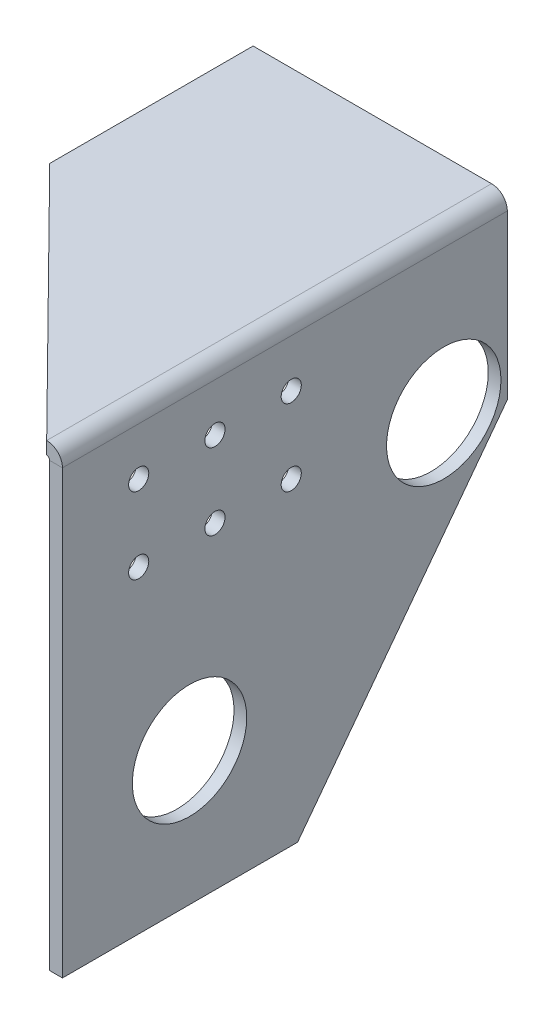
ISO-10303-21;
HEADER;
FILE_DESCRIPTION(('STEP AP214'),'2;1');
FILE_NAME('part.step','',(''),(''),'','','');
FILE_SCHEMA(('AUTOMOTIVE_DESIGN { 1 0 10303 214 1 1 1 1 }'));
ENDSEC;
DATA;
#1=APPLICATION_CONTEXT('core data for automotive mechanical design processes');
#2=APPLICATION_PROTOCOL_DEFINITION('international standard','automotive_design',2000,#1);
#3=PRODUCT_CONTEXT('',#1,'mechanical');
#4=PRODUCT('Part','Part','',(#3));
#5=PRODUCT_RELATED_PRODUCT_CATEGORY('part','',(#4));
#6=PRODUCT_DEFINITION_FORMATION('','',#4);
#7=PRODUCT_DEFINITION_CONTEXT('part definition',#1,'design');
#8=PRODUCT_DEFINITION('design','',#6,#7);
#9=PRODUCT_DEFINITION_SHAPE('','',#8);
#10=(LENGTH_UNIT() NAMED_UNIT(*) SI_UNIT(.MILLI.,.METRE.));
#11=(NAMED_UNIT(*) PLANE_ANGLE_UNIT() SI_UNIT($,.RADIAN.));
#12=(NAMED_UNIT(*) SI_UNIT($,.STERADIAN.) SOLID_ANGLE_UNIT());
#13=UNCERTAINTY_MEASURE_WITH_UNIT(LENGTH_MEASURE(1.E-05),#10,'distance_accuracy_value','');
#14=(GEOMETRIC_REPRESENTATION_CONTEXT(3) GLOBAL_UNCERTAINTY_ASSIGNED_CONTEXT((#13)) GLOBAL_UNIT_ASSIGNED_CONTEXT((#10,
#11,#12)) REPRESENTATION_CONTEXT('',''));
#15=CARTESIAN_POINT('',(0.,0.,0.));
#16=DIRECTION('',(0.,0.,1.));
#17=DIRECTION('',(1.,0.,0.));
#18=AXIS2_PLACEMENT_3D('',#15,#16,#17);
#19=CARTESIAN_POINT('',(0.,0.,111.125));
#20=DIRECTION('',(0.,1.,0.));
#21=DIRECTION('',(0.,0.,1.));
#22=AXIS2_PLACEMENT_3D('',#19,#20,#21);
#23=PLANE('',#22);
#24=DIRECTION('',(0.,0.,-1.));
#25=VECTOR('',#24,1.);
#26=CARTESIAN_POINT('',(0.,0.,111.125));
#27=LINE('',#26,#25);
#28=CARTESIAN_POINT('',(0.,0.,50.8));
#29=VERTEX_POINT('',#28);
#30=CARTESIAN_POINT('',(0.,0.,0.));
#31=VERTEX_POINT('',#30);
#32=EDGE_CURVE('E172',#29,#31,#27,.T.);
#33=ORIENTED_EDGE('',*,*,#32,.F.);
#34=DIRECTION('',(0.702598266829906,0.,0.711586730797879));
#35=VECTOR('',#34,1.);
#36=CARTESIAN_POINT('',(0.,0.,50.8));
#37=LINE('',#36,#35);
#38=CARTESIAN_POINT('',(59.563,0.,111.125));
#39=VERTEX_POINT('',#38);
#40=EDGE_CURVE('E189',#29,#39,#37,.T.);
#41=ORIENTED_EDGE('',*,*,#40,.T.);
#42=DIRECTION('',(0.,0.,-1.));
#43=VECTOR('',#42,1.);
#44=CARTESIAN_POINT('',(59.563,0.,111.125));
#45=LINE('',#44,#43);
#46=CARTESIAN_POINT('',(59.563,0.,0.));
#47=VERTEX_POINT('',#46);
#48=EDGE_CURVE('E133',#39,#47,#45,.T.);
#49=ORIENTED_EDGE('',*,*,#48,.T.);
#50=DIRECTION('',(1.,0.,0.));
#51=VECTOR('',#50,1.);
#52=CARTESIAN_POINT('',(0.,0.,0.));
#53=LINE('',#52,#51);
#54=EDGE_CURVE('E154',#31,#47,#53,.T.);
#55=ORIENTED_EDGE('',*,*,#54,.F.);
#56=EDGE_LOOP('',(#33,#41,#49,#55));
#57=FACE_BOUND('',#56,.T.);
#58=ADVANCED_FACE('F45',(#57),#23,.T.);
#59=CARTESIAN_POINT('',(0.,-3.175,111.125));
#60=DIRECTION('',(-1.,0.,0.));
#61=DIRECTION('',(0.,0.,1.));
#62=AXIS2_PLACEMENT_3D('',#59,#60,#61);
#63=PLANE('',#62);
#64=DIRECTION('',(0.,0.,-1.));
#65=VECTOR('',#64,1.);
#66=CARTESIAN_POINT('',(0.,-3.175,111.125));
#67=LINE('',#66,#65);
#68=CARTESIAN_POINT('',(0.,-3.175,50.8));
#69=VERTEX_POINT('',#68);
#70=CARTESIAN_POINT('',(0.,-3.175,0.));
#71=VERTEX_POINT('',#70);
#72=EDGE_CURVE('E170',#69,#71,#67,.T.);
#73=ORIENTED_EDGE('',*,*,#72,.F.);
#74=DIRECTION('',(0.,1.,0.));
#75=VECTOR('',#74,1.);
#76=CARTESIAN_POINT('',(0.,0.,50.8));
#77=LINE('',#76,#75);
#78=EDGE_CURVE('E199',#29,#69,#77,.F.);
#79=ORIENTED_EDGE('',*,*,#78,.F.);
#80=ORIENTED_EDGE('',*,*,#32,.T.);
#81=DIRECTION('',(0.,1.,0.));
#82=VECTOR('',#81,1.);
#83=CARTESIAN_POINT('',(0.,-3.175,0.));
#84=LINE('',#83,#82);
#85=EDGE_CURVE('E157',#71,#31,#84,.T.);
#86=ORIENTED_EDGE('',*,*,#85,.F.);
#87=EDGE_LOOP('',(#73,#79,#80,#86));
#88=FACE_BOUND('',#87,.T.);
#89=ADVANCED_FACE('F271',(#88),#63,.T.);
#90=CARTESIAN_POINT('',(0.,-3.175,111.125));
#91=DIRECTION('',(0.,1.,0.));
#92=DIRECTION('',(0.,0.,1.));
#93=AXIS2_PLACEMENT_3D('',#90,#91,#92);
#94=PLANE('',#93);
#95=DIRECTION('',(0.702598266829906,0.,0.711586730797879));
#96=VECTOR('',#95,1.);
#97=CARTESIAN_POINT('',(0.,-3.175,50.8));
#98=LINE('',#97,#96);
#99=CARTESIAN_POINT('',(59.563,-3.175,111.125));
#100=VERTEX_POINT('',#99);
#101=EDGE_CURVE('E192',#69,#100,#98,.T.);
#102=ORIENTED_EDGE('',*,*,#101,.F.);
#103=ORIENTED_EDGE('',*,*,#72,.T.);
#104=DIRECTION('',(1.,0.,0.));
#105=VECTOR('',#104,1.);
#106=CARTESIAN_POINT('',(0.,-3.175,0.));
#107=LINE('',#106,#105);
#108=CARTESIAN_POINT('',(59.563,-3.175,0.));
#109=VERTEX_POINT('',#108);
#110=EDGE_CURVE('E160',#71,#109,#107,.T.);
#111=ORIENTED_EDGE('',*,*,#110,.T.);
#112=DIRECTION('',(0.,0.,-1.));
#113=VECTOR('',#112,1.);
#114=CARTESIAN_POINT('',(59.563,-3.175,111.125));
#115=LINE('',#114,#113);
#116=EDGE_CURVE('E167',#100,#109,#115,.T.);
#117=ORIENTED_EDGE('',*,*,#116,.F.);
#118=EDGE_LOOP('',(#102,#103,#111,#117));
#119=FACE_BOUND('',#118,.T.);
#120=ADVANCED_FACE('F268',(#119),#94,.F.);
#121=CARTESIAN_POINT('',(63.5,-3.937,111.125));
#122=DIRECTION('',(0.,0.,1.));
#123=DIRECTION('',(1.,0.,0.));
#124=AXIS2_PLACEMENT_3D('',#121,#122,#123);
#125=PLANE('',#124);
#126=DIRECTION('',(-1.,0.,0.));
#127=VECTOR('',#126,1.);
#128=CARTESIAN_POINT('',(63.5,-3.937,111.125));
#129=LINE('',#128,#127);
#130=CARTESIAN_POINT('',(63.5,-3.937,111.125));
#131=VERTEX_POINT('',#130);
#132=CARTESIAN_POINT('',(60.325,-3.937,111.125));
#133=VERTEX_POINT('',#132);
#134=EDGE_CURVE('E53',#131,#133,#129,.T.);
#135=ORIENTED_EDGE('',*,*,#134,.F.);
#136=CARTESIAN_POINT('',(59.563,-3.937,111.125));
#137=DIRECTION('',(0.,0.,1.));
#138=DIRECTION('',(1.,0.,0.));
#139=AXIS2_PLACEMENT_3D('',#136,#137,#138);
#140=CIRCLE('',#139,3.937);
#141=EDGE_CURVE('E113',#39,#131,#140,.F.);
#142=ORIENTED_EDGE('',*,*,#141,.F.);
#143=DIRECTION('',(0.,1.,0.));
#144=VECTOR('',#143,1.);
#145=CARTESIAN_POINT('',(59.563,-3.175,111.125));
#146=LINE('',#145,#144);
#147=EDGE_CURVE('E117',#100,#39,#146,.T.);
#148=ORIENTED_EDGE('',*,*,#147,.F.);
#149=CARTESIAN_POINT('',(59.563,-3.937,111.125));
#150=DIRECTION('',(0.,0.,1.));
#151=DIRECTION('',(1.,0.,0.));
#152=AXIS2_PLACEMENT_3D('',#149,#150,#151);
#153=CIRCLE('',#152,0.762);
#154=EDGE_CURVE('E115',#100,#133,#153,.F.);
#155=ORIENTED_EDGE('',*,*,#154,.T.);
#156=EDGE_LOOP('',(#135,#142,#148,#155));
#157=FACE_BOUND('',#156,.T.);
#158=ADVANCED_FACE('F47',(#157),#125,.T.);
#159=CARTESIAN_POINT('',(59.563,-3.175,111.125));
#160=DIRECTION('',(0.,0.,1.));
#161=DIRECTION('',(1.,0.,0.));
#162=AXIS2_PLACEMENT_3D('',#159,#160,#161);
#163=PLANE('',#162);
#164=DIRECTION('',(0.,-1.,0.));
#165=VECTOR('',#164,1.);
#166=CARTESIAN_POINT('',(63.5,0.,111.125));
#167=LINE('',#166,#165);
#168=CARTESIAN_POINT('',(63.5,-114.3,111.125));
#169=VERTEX_POINT('',#168);
#170=EDGE_CURVE('E127',#131,#169,#167,.T.);
#171=ORIENTED_EDGE('',*,*,#170,.F.);
#172=ORIENTED_EDGE('',*,*,#134,.T.);
#173=DIRECTION('',(0.,-1.,0.));
#174=VECTOR('',#173,1.);
#175=CARTESIAN_POINT('',(60.325,0.,111.125));
#176=LINE('',#175,#174);
#177=CARTESIAN_POINT('',(60.325,-114.3,111.125));
#178=VERTEX_POINT('',#177);
#179=EDGE_CURVE('E101',#133,#178,#176,.T.);
#180=ORIENTED_EDGE('',*,*,#179,.T.);
#181=DIRECTION('',(-1.,0.,0.));
#182=VECTOR('',#181,1.);
#183=CARTESIAN_POINT('',(63.5,-114.3,111.125));
#184=LINE('',#183,#182);
#185=EDGE_CURVE('E137',#169,#178,#184,.T.);
#186=ORIENTED_EDGE('',*,*,#185,.F.);
#187=EDGE_LOOP('',(#171,#172,#180,#186));
#188=FACE_BOUND('',#187,.T.);
#189=ADVANCED_FACE('F135',(#188),#163,.T.);
#190=CARTESIAN_POINT('',(59.563,0.,0.));
#191=DIRECTION('',(0.,0.,-1.));
#192=DIRECTION('',(-1.,0.,0.));
#193=AXIS2_PLACEMENT_3D('',#190,#191,#192);
#194=PLANE('',#193);
#195=DIRECTION('',(0.,-1.,0.));
#196=VECTOR('',#195,1.);
#197=CARTESIAN_POINT('',(59.563,0.,0.));
#198=LINE('',#197,#196);
#199=EDGE_CURVE('E180',#47,#109,#198,.T.);
#200=ORIENTED_EDGE('',*,*,#199,.F.);
#201=CARTESIAN_POINT('',(59.563,-3.937,0.));
#202=DIRECTION('',(0.,0.,1.));
#203=DIRECTION('',(1.,0.,0.));
#204=AXIS2_PLACEMENT_3D('',#201,#202,#203);
#205=CIRCLE('',#204,3.937);
#206=CARTESIAN_POINT('',(63.5,-3.937,0.));
#207=VERTEX_POINT('',#206);
#208=EDGE_CURVE('E152',#47,#207,#205,.F.);
#209=ORIENTED_EDGE('',*,*,#208,.T.);
#210=DIRECTION('',(1.,0.,0.));
#211=VECTOR('',#210,1.);
#212=CARTESIAN_POINT('',(60.325,-3.937,0.));
#213=LINE('',#212,#211);
#214=CARTESIAN_POINT('',(60.325,-3.937,0.));
#215=VERTEX_POINT('',#214);
#216=EDGE_CURVE('E95',#215,#207,#213,.T.);
#217=ORIENTED_EDGE('',*,*,#216,.F.);
#218=CARTESIAN_POINT('',(59.563,-3.937,0.));
#219=DIRECTION('',(0.,0.,1.));
#220=DIRECTION('',(1.,0.,0.));
#221=AXIS2_PLACEMENT_3D('',#218,#219,#220);
#222=CIRCLE('',#221,0.762);
#223=EDGE_CURVE('E163',#109,#215,#222,.F.);
#224=ORIENTED_EDGE('',*,*,#223,.F.);
#225=EDGE_LOOP('',(#200,#209,#217,#224));
#226=FACE_BOUND('',#225,.T.);
#227=ADVANCED_FACE('F276',(#226),#194,.T.);
#228=CARTESIAN_POINT('',(60.325,-3.937,0.));
#229=DIRECTION('',(0.,0.,-1.));
#230=DIRECTION('',(-1.,0.,0.));
#231=AXIS2_PLACEMENT_3D('',#228,#229,#230);
#232=PLANE('',#231);
#233=ORIENTED_EDGE('',*,*,#54,.T.);
#234=ORIENTED_EDGE('',*,*,#199,.T.);
#235=ORIENTED_EDGE('',*,*,#110,.F.);
#236=ORIENTED_EDGE('',*,*,#85,.T.);
#237=EDGE_LOOP('',(#233,#234,#235,#236));
#238=FACE_BOUND('',#237,.T.);
#239=ADVANCED_FACE('F273',(#238),#232,.T.);
#240=CARTESIAN_POINT('',(60.325,0.,111.125));
#241=DIRECTION('',(1.,0.,0.));
#242=DIRECTION('',(0.,1.,0.));
#243=AXIS2_PLACEMENT_3D('',#240,#241,#242);
#244=PLANE('',#243);
#245=CARTESIAN_POINT('',(60.325,-15.875,73.025));
#246=DIRECTION('',(1.,0.,0.));
#247=DIRECTION('',(0.,1.,0.));
#248=AXIS2_PLACEMENT_3D('',#245,#246,#247);
#249=CIRCLE('',#248,2.51460000000001);
#250=CARTESIAN_POINT('',(60.325,-13.3604,73.025));
#251=VERTEX_POINT('',#250);
#252=EDGE_CURVE('E150',#251,#251,#249,.T.);
#253=ORIENTED_EDGE('',*,*,#252,.T.);
#254=EDGE_LOOP('',(#253));
#255=FACE_BOUND('',#254,.T.);
#256=CARTESIAN_POINT('',(60.325,-34.925,53.975));
#257=DIRECTION('',(1.,0.,0.));
#258=DIRECTION('',(0.,1.,0.));
#259=AXIS2_PLACEMENT_3D('',#256,#257,#258);
#260=CIRCLE('',#259,2.51460000000001);
#261=CARTESIAN_POINT('',(60.325,-32.4104,53.975));
#262=VERTEX_POINT('',#261);
#263=EDGE_CURVE('E252',#262,#262,#260,.T.);
#264=ORIENTED_EDGE('',*,*,#263,.T.);
#265=EDGE_LOOP('',(#264));
#266=FACE_BOUND('',#265,.T.);
#267=CARTESIAN_POINT('',(60.325,-15.875,53.975));
#268=DIRECTION('',(1.,0.,0.));
#269=DIRECTION('',(0.,1.,0.));
#270=AXIS2_PLACEMENT_3D('',#267,#268,#269);
#271=CIRCLE('',#270,2.51460000000001);
#272=CARTESIAN_POINT('',(60.325,-13.3604,53.975));
#273=VERTEX_POINT('',#272);
#274=EDGE_CURVE('E249',#273,#273,#271,.T.);
#275=ORIENTED_EDGE('',*,*,#274,.T.);
#276=EDGE_LOOP('',(#275));
#277=FACE_BOUND('',#276,.T.);
#278=CARTESIAN_POINT('',(60.325,-39.6875,15.875));
#279=DIRECTION('',(1.,0.,0.));
#280=DIRECTION('',(0.,1.,0.));
#281=AXIS2_PLACEMENT_3D('',#278,#279,#280);
#282=CIRCLE('',#281,14.2875);
#283=CARTESIAN_POINT('',(60.325,-25.4,15.875));
#284=VERTEX_POINT('',#283);
#285=EDGE_CURVE('E246',#284,#284,#282,.T.);
#286=ORIENTED_EDGE('',*,*,#285,.T.);
#287=EDGE_LOOP('',(#286));
#288=FACE_BOUND('',#287,.T.);
#289=CARTESIAN_POINT('',(60.325,-34.925,92.075));
#290=DIRECTION('',(1.,0.,0.));
#291=DIRECTION('',(0.,1.,0.));
#292=AXIS2_PLACEMENT_3D('',#289,#290,#291);
#293=CIRCLE('',#292,2.51460000000001);
#294=CARTESIAN_POINT('',(60.325,-32.4104,92.075));
#295=VERTEX_POINT('',#294);
#296=EDGE_CURVE('E243',#295,#295,#293,.T.);
#297=ORIENTED_EDGE('',*,*,#296,.T.);
#298=EDGE_LOOP('',(#297));
#299=FACE_BOUND('',#298,.T.);
#300=CARTESIAN_POINT('',(60.325,-15.875,92.075));
#301=DIRECTION('',(1.,0.,0.));
#302=DIRECTION('',(0.,1.,0.));
#303=AXIS2_PLACEMENT_3D('',#300,#301,#302);
#304=CIRCLE('',#303,2.51460000000001);
#305=CARTESIAN_POINT('',(60.325,-13.3604,92.075));
#306=VERTEX_POINT('',#305);
#307=EDGE_CURVE('E240',#306,#306,#304,.T.);
#308=ORIENTED_EDGE('',*,*,#307,.T.);
#309=EDGE_LOOP('',(#308));
#310=FACE_BOUND('',#309,.T.);
#311=CARTESIAN_POINT('',(60.325,-34.925,73.025));
#312=DIRECTION('',(1.,0.,0.));
#313=DIRECTION('',(0.,1.,0.));
#314=AXIS2_PLACEMENT_3D('',#311,#312,#313);
#315=CIRCLE('',#314,2.51460000000001);
#316=CARTESIAN_POINT('',(60.325,-32.4104,73.025));
#317=VERTEX_POINT('',#316);
#318=EDGE_CURVE('E237',#317,#317,#315,.T.);
#319=ORIENTED_EDGE('',*,*,#318,.T.);
#320=EDGE_LOOP('',(#319));
#321=FACE_BOUND('',#320,.T.);
#322=CARTESIAN_POINT('',(60.325,-80.9625,79.375));
#323=DIRECTION('',(1.,0.,0.));
#324=DIRECTION('',(0.,1.,0.));
#325=AXIS2_PLACEMENT_3D('',#322,#323,#324);
#326=CIRCLE('',#325,14.2875);
#327=CARTESIAN_POINT('',(60.325,-66.675,79.375));
#328=VERTEX_POINT('',#327);
#329=EDGE_CURVE('E234',#328,#328,#326,.T.);
#330=ORIENTED_EDGE('',*,*,#329,.T.);
#331=EDGE_LOOP('',(#330));
#332=FACE_BOUND('',#331,.T.);
#333=DIRECTION('',(0.,-1.,0.));
#334=VECTOR('',#333,1.);
#335=CARTESIAN_POINT('',(60.325,0.,0.));
#336=LINE('',#335,#334);
#337=CARTESIAN_POINT('',(60.325,-44.7748258484127,0.));
#338=VERTEX_POINT('',#337);
#339=EDGE_CURVE('E147',#215,#338,#336,.T.);
#340=ORIENTED_EDGE('',*,*,#339,.T.);
#341=DIRECTION('',(0.,-0.798654704242243,0.601789550749874));
#342=VECTOR('',#341,1.);
#343=CARTESIAN_POINT('',(60.325,-69.6243588206045,18.7242236278667));
#344=LINE('',#343,#342);
#345=CARTESIAN_POINT('',(60.325,-114.3,52.3875));
#346=VERTEX_POINT('',#345);
#347=EDGE_CURVE('E60',#338,#346,#344,.T.);
#348=ORIENTED_EDGE('',*,*,#347,.T.);
#349=DIRECTION('',(0.,0.,-1.));
#350=VECTOR('',#349,1.);
#351=CARTESIAN_POINT('',(60.325,-114.3,111.125));
#352=LINE('',#351,#350);
#353=EDGE_CURVE('E176',#178,#346,#352,.T.);
#354=ORIENTED_EDGE('',*,*,#353,.F.);
#355=ORIENTED_EDGE('',*,*,#179,.F.);
#356=DIRECTION('',(0.,0.,-1.));
#357=VECTOR('',#356,1.);
#358=CARTESIAN_POINT('',(60.325,-3.937,111.125));
#359=LINE('',#358,#357);
#360=EDGE_CURVE('E143',#133,#215,#359,.T.);
#361=ORIENTED_EDGE('',*,*,#360,.T.);
#362=EDGE_LOOP('',(#340,#348,#354,#355,#361));
#363=FACE_BOUND('',#362,.T.);
#364=ADVANCED_FACE('F283',(#255,#266,#277,#288,#299,#310,#321,#332,#363),#244,.F.);
#365=CARTESIAN_POINT('',(63.5,-114.3,111.125));
#366=DIRECTION('',(0.,-1.,0.));
#367=DIRECTION('',(0.,0.,-1.));
#368=AXIS2_PLACEMENT_3D('',#365,#366,#367);
#369=PLANE('',#368);
#370=DIRECTION('',(1.,0.,0.));
#371=VECTOR('',#370,1.);
#372=CARTESIAN_POINT('',(0.,-114.3,52.3875));
#373=LINE('',#372,#371);
#374=CARTESIAN_POINT('',(63.5,-114.3,52.3875));
#375=VERTEX_POINT('',#374);
#376=EDGE_CURVE('E203',#346,#375,#373,.T.);
#377=ORIENTED_EDGE('',*,*,#376,.T.);
#378=DIRECTION('',(0.,0.,-1.));
#379=VECTOR('',#378,1.);
#380=CARTESIAN_POINT('',(63.5,-114.3,111.125));
#381=LINE('',#380,#379);
#382=EDGE_CURVE('E132',#169,#375,#381,.T.);
#383=ORIENTED_EDGE('',*,*,#382,.F.);
#384=ORIENTED_EDGE('',*,*,#185,.T.);
#385=ORIENTED_EDGE('',*,*,#353,.T.);
#386=EDGE_LOOP('',(#377,#383,#384,#385));
#387=FACE_BOUND('',#386,.T.);
#388=ADVANCED_FACE('F258',(#387),#369,.T.);
#389=CARTESIAN_POINT('',(63.5,0.,111.125));
#390=DIRECTION('',(1.,0.,0.));
#391=DIRECTION('',(0.,1.,0.));
#392=AXIS2_PLACEMENT_3D('',#389,#390,#391);
#393=PLANE('',#392);
#394=CARTESIAN_POINT('',(63.5,-15.875,73.025));
#395=DIRECTION('',(1.,0.,0.));
#396=DIRECTION('',(0.,0.,-1.));
#397=AXIS2_PLACEMENT_3D('',#394,#395,#396);
#398=CIRCLE('',#397,2.51460000000001);
#399=CARTESIAN_POINT('',(63.5,-15.875,70.5104));
#400=VERTEX_POINT('',#399);
#401=EDGE_CURVE('E216',#400,#400,#398,.T.);
#402=ORIENTED_EDGE('',*,*,#401,.F.);
#403=EDGE_LOOP('',(#402));
#404=FACE_BOUND('',#403,.T.);
#405=CARTESIAN_POINT('',(63.5,-34.925,53.975));
#406=DIRECTION('',(1.,0.,0.));
#407=DIRECTION('',(0.,0.,-1.));
#408=AXIS2_PLACEMENT_3D('',#405,#406,#407);
#409=CIRCLE('',#408,2.51460000000001);
#410=CARTESIAN_POINT('',(63.5,-34.925,51.4604));
#411=VERTEX_POINT('',#410);
#412=EDGE_CURVE('E219',#411,#411,#409,.T.);
#413=ORIENTED_EDGE('',*,*,#412,.F.);
#414=EDGE_LOOP('',(#413));
#415=FACE_BOUND('',#414,.T.);
#416=CARTESIAN_POINT('',(63.5,-15.875,53.975));
#417=DIRECTION('',(1.,0.,0.));
#418=DIRECTION('',(0.,0.,-1.));
#419=AXIS2_PLACEMENT_3D('',#416,#417,#418);
#420=CIRCLE('',#419,2.51460000000001);
#421=CARTESIAN_POINT('',(63.5,-15.875,51.4604));
#422=VERTEX_POINT('',#421);
#423=EDGE_CURVE('E222',#422,#422,#420,.T.);
#424=ORIENTED_EDGE('',*,*,#423,.F.);
#425=EDGE_LOOP('',(#424));
#426=FACE_BOUND('',#425,.T.);
#427=CARTESIAN_POINT('',(63.5,-39.6875,15.875));
#428=DIRECTION('',(1.,0.,0.));
#429=DIRECTION('',(0.,0.,-1.));
#430=AXIS2_PLACEMENT_3D('',#427,#428,#429);
#431=CIRCLE('',#430,14.2875);
#432=CARTESIAN_POINT('',(63.5,-39.6875,1.5875));
#433=VERTEX_POINT('',#432);
#434=EDGE_CURVE('E225',#433,#433,#431,.T.);
#435=ORIENTED_EDGE('',*,*,#434,.F.);
#436=EDGE_LOOP('',(#435));
#437=FACE_BOUND('',#436,.T.);
#438=DIRECTION('',(0.,-0.798654704242243,0.601789550749874));
#439=VECTOR('',#438,1.);
#440=CARTESIAN_POINT('',(63.5,-44.7748258484127,0.));
#441=LINE('',#440,#439);
#442=CARTESIAN_POINT('',(63.5,-44.7748258484127,0.));
#443=VERTEX_POINT('',#442);
#444=EDGE_CURVE('E208',#443,#375,#441,.T.);
#445=ORIENTED_EDGE('',*,*,#444,.F.);
#446=DIRECTION('',(0.,-1.,0.));
#447=VECTOR('',#446,1.);
#448=CARTESIAN_POINT('',(63.5,0.,0.));
#449=LINE('',#448,#447);
#450=EDGE_CURVE('E129',#207,#443,#449,.T.);
#451=ORIENTED_EDGE('',*,*,#450,.F.);
#452=DIRECTION('',(0.,0.,-1.));
#453=VECTOR('',#452,1.);
#454=CARTESIAN_POINT('',(63.5,-3.937,111.125));
#455=LINE('',#454,#453);
#456=EDGE_CURVE('E122',#131,#207,#455,.T.);
#457=ORIENTED_EDGE('',*,*,#456,.F.);
#458=ORIENTED_EDGE('',*,*,#170,.T.);
#459=ORIENTED_EDGE('',*,*,#382,.T.);
#460=EDGE_LOOP('',(#445,#451,#457,#458,#459));
#461=FACE_BOUND('',#460,.T.);
#462=CARTESIAN_POINT('',(63.5,-34.925,92.075));
#463=DIRECTION('',(1.,0.,0.));
#464=DIRECTION('',(0.,0.,-1.));
#465=AXIS2_PLACEMENT_3D('',#462,#463,#464);
#466=CIRCLE('',#465,2.51460000000001);
#467=CARTESIAN_POINT('',(63.5,-34.925,89.5604));
#468=VERTEX_POINT('',#467);
#469=EDGE_CURVE('E204',#468,#468,#466,.T.);
#470=ORIENTED_EDGE('',*,*,#469,.F.);
#471=EDGE_LOOP('',(#470));
#472=FACE_BOUND('',#471,.T.);
#473=CARTESIAN_POINT('',(63.5,-15.875,92.075));
#474=DIRECTION('',(1.,0.,0.));
#475=DIRECTION('',(0.,0.,-1.));
#476=AXIS2_PLACEMENT_3D('',#473,#474,#475);
#477=CIRCLE('',#476,2.51460000000001);
#478=CARTESIAN_POINT('',(63.5,-15.875,89.5604));
#479=VERTEX_POINT('',#478);
#480=EDGE_CURVE('E207',#479,#479,#477,.T.);
#481=ORIENTED_EDGE('',*,*,#480,.F.);
#482=EDGE_LOOP('',(#481));
#483=FACE_BOUND('',#482,.T.);
#484=CARTESIAN_POINT('',(63.5,-34.925,73.025));
#485=DIRECTION('',(1.,0.,0.));
#486=DIRECTION('',(0.,0.,-1.));
#487=AXIS2_PLACEMENT_3D('',#484,#485,#486);
#488=CIRCLE('',#487,2.51460000000001);
#489=CARTESIAN_POINT('',(63.5,-34.925,70.5104));
#490=VERTEX_POINT('',#489);
#491=EDGE_CURVE('E213',#490,#490,#488,.T.);
#492=ORIENTED_EDGE('',*,*,#491,.F.);
#493=EDGE_LOOP('',(#492));
#494=FACE_BOUND('',#493,.T.);
#495=CARTESIAN_POINT('',(63.5,-80.9625,79.375));
#496=DIRECTION('',(1.,0.,0.));
#497=DIRECTION('',(0.,0.,-1.));
#498=AXIS2_PLACEMENT_3D('',#495,#496,#497);
#499=CIRCLE('',#498,14.2875);
#500=CARTESIAN_POINT('',(63.5,-80.9625,65.0875));
#501=VERTEX_POINT('',#500);
#502=EDGE_CURVE('E228',#501,#501,#499,.T.);
#503=ORIENTED_EDGE('',*,*,#502,.F.);
#504=EDGE_LOOP('',(#503));
#505=FACE_BOUND('',#504,.T.);
#506=ADVANCED_FACE('F124',(#404,#415,#426,#437,#461,#472,#483,#494,#505),#393,.T.);
#507=CARTESIAN_POINT('',(59.563,-3.937,111.125));
#508=DIRECTION('',(0.,0.,-1.));
#509=DIRECTION('',(-1.,0.,0.));
#510=AXIS2_PLACEMENT_3D('',#507,#508,#509);
#511=CYLINDRICAL_SURFACE('',#510,3.937);
#512=ORIENTED_EDGE('',*,*,#208,.F.);
#513=ORIENTED_EDGE('',*,*,#48,.F.);
#514=ORIENTED_EDGE('',*,*,#141,.T.);
#515=ORIENTED_EDGE('',*,*,#456,.T.);
#516=EDGE_LOOP('',(#512,#513,#514,#515));
#517=FACE_BOUND('',#516,.T.);
#518=ADVANCED_FACE('F140',(#517),#511,.T.);
#519=CARTESIAN_POINT('',(59.563,-3.937,111.125));
#520=DIRECTION('',(0.,0.,-1.));
#521=DIRECTION('',(-1.,0.,0.));
#522=AXIS2_PLACEMENT_3D('',#519,#520,#521);
#523=CYLINDRICAL_SURFACE('',#522,0.762);
#524=ORIENTED_EDGE('',*,*,#223,.T.);
#525=ORIENTED_EDGE('',*,*,#360,.F.);
#526=ORIENTED_EDGE('',*,*,#154,.F.);
#527=ORIENTED_EDGE('',*,*,#116,.T.);
#528=EDGE_LOOP('',(#524,#525,#526,#527));
#529=FACE_BOUND('',#528,.T.);
#530=ADVANCED_FACE('F275',(#529),#523,.F.);
#531=CARTESIAN_POINT('',(59.563,-3.937,0.));
#532=DIRECTION('',(0.,0.,1.));
#533=DIRECTION('',(1.,0.,0.));
#534=AXIS2_PLACEMENT_3D('',#531,#532,#533);
#535=PLANE('',#534);
#536=ORIENTED_EDGE('',*,*,#450,.T.);
#537=DIRECTION('',(-1.,0.,0.));
#538=VECTOR('',#537,1.);
#539=CARTESIAN_POINT('',(59.563,-44.7748258484127,0.));
#540=LINE('',#539,#538);
#541=EDGE_CURVE('E11',#443,#338,#540,.T.);
#542=ORIENTED_EDGE('',*,*,#541,.T.);
#543=ORIENTED_EDGE('',*,*,#339,.F.);
#544=ORIENTED_EDGE('',*,*,#216,.T.);
#545=EDGE_LOOP('',(#536,#542,#543,#544));
#546=FACE_BOUND('',#545,.T.);
#547=ADVANCED_FACE('F322',(#546),#535,.F.);
#548=CARTESIAN_POINT('',(0.,-44.7748258484127,0.));
#549=DIRECTION('',(0.,0.601789550749874,0.798654704242243));
#550=DIRECTION('',(0.,-0.798654704242243,0.601789550749874));
#551=AXIS2_PLACEMENT_3D('',#548,#549,#550);
#552=PLANE('',#551);
#553=ORIENTED_EDGE('',*,*,#541,.F.);
#554=ORIENTED_EDGE('',*,*,#444,.T.);
#555=ORIENTED_EDGE('',*,*,#376,.F.);
#556=ORIENTED_EDGE('',*,*,#347,.F.);
#557=EDGE_LOOP('',(#553,#554,#555,#556));
#558=FACE_BOUND('',#557,.T.);
#559=ADVANCED_FACE('F323',(#558),#552,.F.);
#560=CARTESIAN_POINT('',(0.,-80.9625,79.375));
#561=DIRECTION('',(1.,0.,0.));
#562=DIRECTION('',(0.,0.,-1.));
#563=AXIS2_PLACEMENT_3D('',#560,#561,#562);
#564=CYLINDRICAL_SURFACE('',#563,14.2875);
#565=ORIENTED_EDGE('',*,*,#502,.T.);
#566=EDGE_LOOP('',(#565));
#567=FACE_BOUND('',#566,.T.);
#568=ORIENTED_EDGE('',*,*,#329,.F.);
#569=EDGE_LOOP('',(#568));
#570=FACE_BOUND('',#569,.T.);
#571=ADVANCED_FACE('F325',(#567,#570),#564,.F.);
#572=CARTESIAN_POINT('',(0.,-34.925,73.025));
#573=DIRECTION('',(1.,0.,0.));
#574=DIRECTION('',(0.,0.,-1.));
#575=AXIS2_PLACEMENT_3D('',#572,#573,#574);
#576=CYLINDRICAL_SURFACE('',#575,2.51460000000001);
#577=ORIENTED_EDGE('',*,*,#491,.T.);
#578=EDGE_LOOP('',(#577));
#579=FACE_BOUND('',#578,.T.);
#580=ORIENTED_EDGE('',*,*,#318,.F.);
#581=EDGE_LOOP('',(#580));
#582=FACE_BOUND('',#581,.T.);
#583=ADVANCED_FACE('F331',(#579,#582),#576,.F.);
#584=CARTESIAN_POINT('',(0.,-15.875,92.075));
#585=DIRECTION('',(1.,0.,0.));
#586=DIRECTION('',(0.,0.,-1.));
#587=AXIS2_PLACEMENT_3D('',#584,#585,#586);
#588=CYLINDRICAL_SURFACE('',#587,2.51460000000001);
#589=ORIENTED_EDGE('',*,*,#480,.T.);
#590=EDGE_LOOP('',(#589));
#591=FACE_BOUND('',#590,.T.);
#592=ORIENTED_EDGE('',*,*,#307,.F.);
#593=EDGE_LOOP('',(#592));
#594=FACE_BOUND('',#593,.T.);
#595=ADVANCED_FACE('F341',(#591,#594),#588,.F.);
#596=CARTESIAN_POINT('',(0.,-34.925,92.075));
#597=DIRECTION('',(1.,0.,0.));
#598=DIRECTION('',(0.,0.,-1.));
#599=AXIS2_PLACEMENT_3D('',#596,#597,#598);
#600=CYLINDRICAL_SURFACE('',#599,2.51460000000001);
#601=ORIENTED_EDGE('',*,*,#469,.T.);
#602=EDGE_LOOP('',(#601));
#603=FACE_BOUND('',#602,.T.);
#604=ORIENTED_EDGE('',*,*,#296,.F.);
#605=EDGE_LOOP('',(#604));
#606=FACE_BOUND('',#605,.T.);
#607=ADVANCED_FACE('F337',(#603,#606),#600,.F.);
#608=CARTESIAN_POINT('',(0.,-39.6875,15.875));
#609=DIRECTION('',(1.,0.,0.));
#610=DIRECTION('',(0.,0.,-1.));
#611=AXIS2_PLACEMENT_3D('',#608,#609,#610);
#612=CYLINDRICAL_SURFACE('',#611,14.2875);
#613=ORIENTED_EDGE('',*,*,#434,.T.);
#614=EDGE_LOOP('',(#613));
#615=FACE_BOUND('',#614,.T.);
#616=ORIENTED_EDGE('',*,*,#285,.F.);
#617=EDGE_LOOP('',(#616));
#618=FACE_BOUND('',#617,.T.);
#619=ADVANCED_FACE('F355',(#615,#618),#612,.F.);
#620=CARTESIAN_POINT('',(0.,-15.875,53.975));
#621=DIRECTION('',(1.,0.,0.));
#622=DIRECTION('',(0.,0.,-1.));
#623=AXIS2_PLACEMENT_3D('',#620,#621,#622);
#624=CYLINDRICAL_SURFACE('',#623,2.51460000000001);
#625=ORIENTED_EDGE('',*,*,#423,.T.);
#626=EDGE_LOOP('',(#625));
#627=FACE_BOUND('',#626,.T.);
#628=ORIENTED_EDGE('',*,*,#274,.F.);
#629=EDGE_LOOP('',(#628));
#630=FACE_BOUND('',#629,.T.);
#631=ADVANCED_FACE('F350',(#627,#630),#624,.F.);
#632=CARTESIAN_POINT('',(0.,-34.925,53.975));
#633=DIRECTION('',(1.,0.,0.));
#634=DIRECTION('',(0.,0.,-1.));
#635=AXIS2_PLACEMENT_3D('',#632,#633,#634);
#636=CYLINDRICAL_SURFACE('',#635,2.51460000000001);
#637=ORIENTED_EDGE('',*,*,#412,.T.);
#638=EDGE_LOOP('',(#637));
#639=FACE_BOUND('',#638,.T.);
#640=ORIENTED_EDGE('',*,*,#263,.F.);
#641=EDGE_LOOP('',(#640));
#642=FACE_BOUND('',#641,.T.);
#643=ADVANCED_FACE('F346',(#639,#642),#636,.F.);
#644=CARTESIAN_POINT('',(0.,-15.875,73.025));
#645=DIRECTION('',(1.,0.,0.));
#646=DIRECTION('',(0.,0.,-1.));
#647=AXIS2_PLACEMENT_3D('',#644,#645,#646);
#648=CYLINDRICAL_SURFACE('',#647,2.51460000000001);
#649=ORIENTED_EDGE('',*,*,#401,.T.);
#650=EDGE_LOOP('',(#649));
#651=FACE_BOUND('',#650,.T.);
#652=ORIENTED_EDGE('',*,*,#252,.F.);
#653=EDGE_LOOP('',(#652));
#654=FACE_BOUND('',#653,.T.);
#655=ADVANCED_FACE('F349',(#651,#654),#648,.F.);
#656=CARTESIAN_POINT('',(0.,0.,50.8));
#657=DIRECTION('',(-0.711586730797879,0.,0.702598266829906));
#658=DIRECTION('',(0.702598266829906,0.,0.711586730797879));
#659=AXIS2_PLACEMENT_3D('',#656,#657,#658);
#660=PLANE('',#659);
#661=ORIENTED_EDGE('',*,*,#40,.F.);
#662=ORIENTED_EDGE('',*,*,#78,.T.);
#663=ORIENTED_EDGE('',*,*,#101,.T.);
#664=ORIENTED_EDGE('',*,*,#147,.T.);
#665=EDGE_LOOP('',(#661,#662,#663,#664));
#666=FACE_BOUND('',#665,.T.);
#667=ADVANCED_FACE('F186',(#666),#660,.T.);
#668=CLOSED_SHELL('',(#58,#89,#120,#158,#189,#227,#239,#364,#388,#506,#518,#530,#547,#559,#571,
#583,#595,#607,#619,#631,#643,#655,#667));
#669=MANIFOLD_SOLID_BREP('B2',#668);
#670=ADVANCED_BREP_SHAPE_REPRESENTATION('',(#18,#669),#14);
#671=SHAPE_DEFINITION_REPRESENTATION(#9,#670);
ENDSEC;
END-ISO-10303-21;
